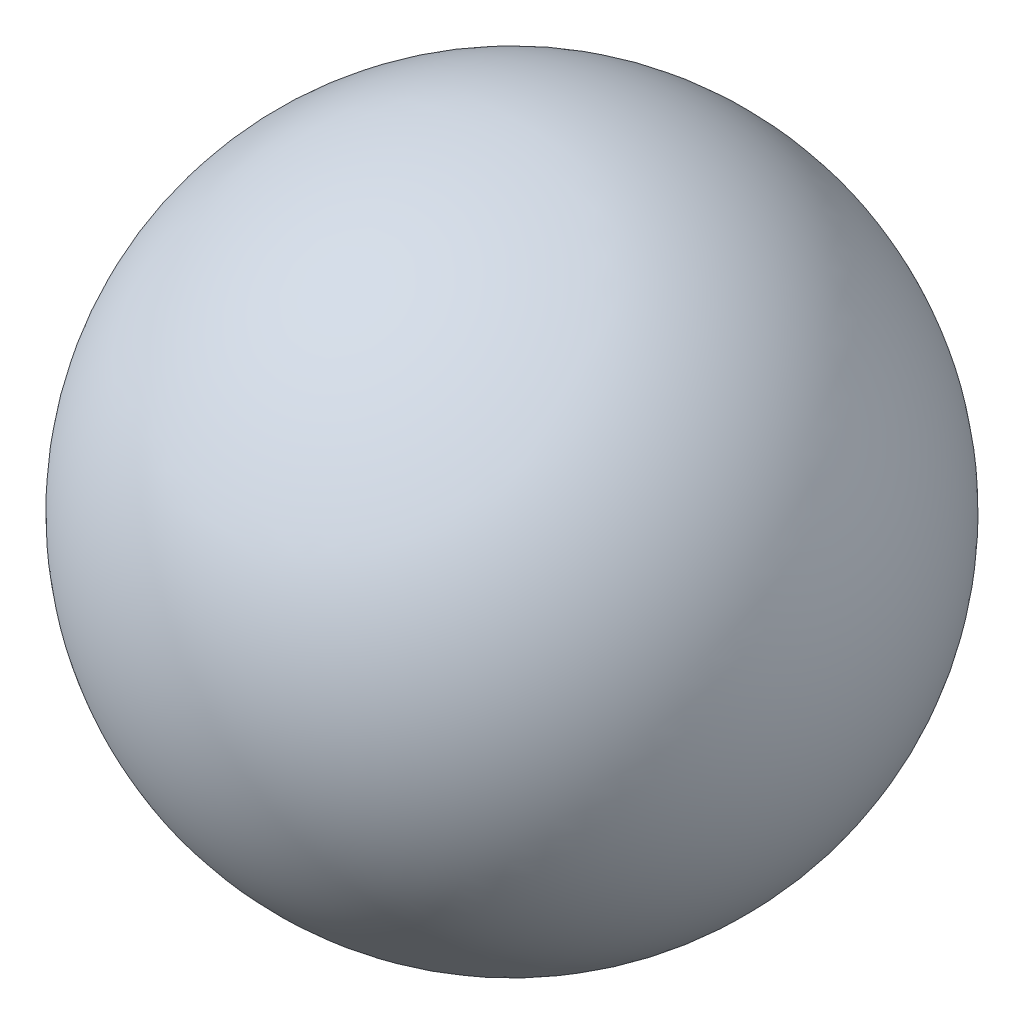
ISO-10303-21;
HEADER;
FILE_DESCRIPTION(('STEP AP214'),'2;1');
FILE_NAME('part.step','',(''),(''),'','','');
FILE_SCHEMA(('AUTOMOTIVE_DESIGN { 1 0 10303 214 1 1 1 1 }'));
ENDSEC;
DATA;
#1=APPLICATION_CONTEXT('core data for automotive mechanical design processes');
#2=APPLICATION_PROTOCOL_DEFINITION('international standard','automotive_design',2000,#1);
#3=PRODUCT_CONTEXT('',#1,'mechanical');
#4=PRODUCT('Part','Part','',(#3));
#5=PRODUCT_RELATED_PRODUCT_CATEGORY('part','',(#4));
#6=PRODUCT_DEFINITION_FORMATION('','',#4);
#7=PRODUCT_DEFINITION_CONTEXT('part definition',#1,'design');
#8=PRODUCT_DEFINITION('design','',#6,#7);
#9=PRODUCT_DEFINITION_SHAPE('','',#8);
#10=(LENGTH_UNIT() NAMED_UNIT(*) SI_UNIT(.MILLI.,.METRE.));
#11=(NAMED_UNIT(*) PLANE_ANGLE_UNIT() SI_UNIT($,.RADIAN.));
#12=(NAMED_UNIT(*) SI_UNIT($,.STERADIAN.) SOLID_ANGLE_UNIT());
#13=UNCERTAINTY_MEASURE_WITH_UNIT(LENGTH_MEASURE(1.E-05),#10,'distance_accuracy_value','');
#14=(GEOMETRIC_REPRESENTATION_CONTEXT(3) GLOBAL_UNCERTAINTY_ASSIGNED_CONTEXT((#13)) GLOBAL_UNIT_ASSIGNED_CONTEXT((#10,
#11,#12)) REPRESENTATION_CONTEXT('',''));
#15=CARTESIAN_POINT('',(0.,0.,0.));
#16=DIRECTION('',(0.,0.,1.));
#17=DIRECTION('',(1.,0.,0.));
#18=AXIS2_PLACEMENT_3D('',#15,#16,#17);
#19=CARTESIAN_POINT('',(0.,0.,0.));
#20=DIRECTION('',(0.,0.,-1.));
#21=DIRECTION('',(1.,0.,0.));
#22=AXIS2_PLACEMENT_3D('',#19,#20,#21);
#23=SPHERICAL_SURFACE('',#22,9.9);
#24=CARTESIAN_POINT('',(0.,0.,-9.9));
#25=VERTEX_POINT('',#24);
#26=VERTEX_LOOP('',#25);
#27=FACE_BOUND('',#26,.T.);
#28=ADVANCED_FACE('F33',(#27),#23,.T.);
#29=CLOSED_SHELL('',(#28));
#30=MANIFOLD_SOLID_BREP('B2',#29);
#31=ADVANCED_BREP_SHAPE_REPRESENTATION('',(#18,#30),#14);
#32=SHAPE_DEFINITION_REPRESENTATION(#9,#31);
ENDSEC;
END-ISO-10303-21;
